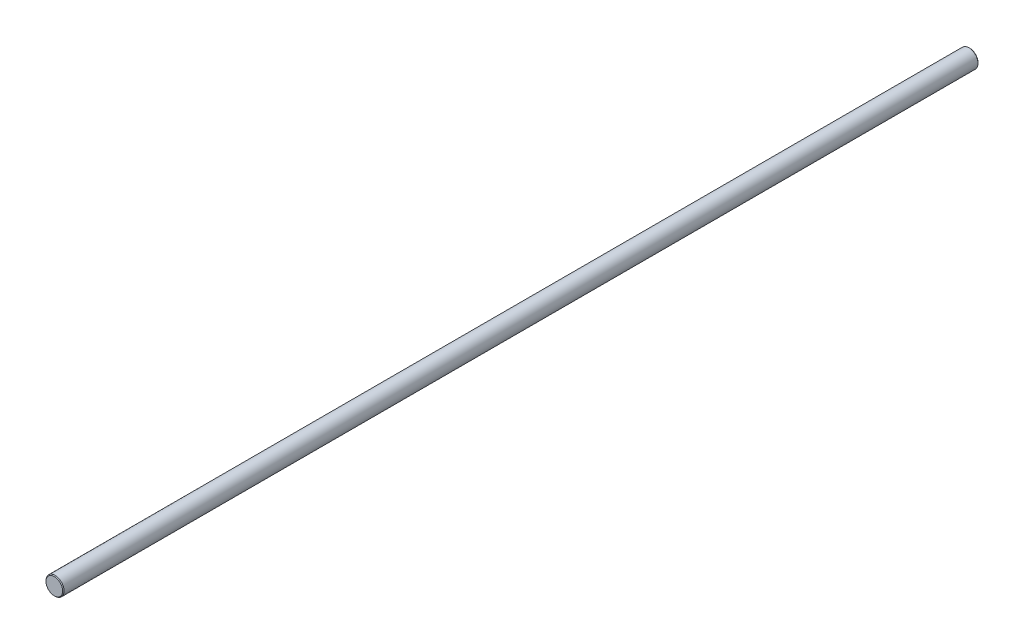
ISO-10303-21;
HEADER;
FILE_DESCRIPTION(('STEP AP214'),'2;1');
FILE_NAME('part.step','',(''),(''),'','','');
FILE_SCHEMA(('AUTOMOTIVE_DESIGN { 1 0 10303 214 1 1 1 1 }'));
ENDSEC;
DATA;
#1=APPLICATION_CONTEXT('core data for automotive mechanical design processes');
#2=APPLICATION_PROTOCOL_DEFINITION('international standard','automotive_design',2000,#1);
#3=PRODUCT_CONTEXT('',#1,'mechanical');
#4=PRODUCT('Part','Part','',(#3));
#5=PRODUCT_RELATED_PRODUCT_CATEGORY('part','',(#4));
#6=PRODUCT_DEFINITION_FORMATION('','',#4);
#7=PRODUCT_DEFINITION_CONTEXT('part definition',#1,'design');
#8=PRODUCT_DEFINITION('design','',#6,#7);
#9=PRODUCT_DEFINITION_SHAPE('','',#8);
#10=(LENGTH_UNIT() NAMED_UNIT(*) SI_UNIT(.MILLI.,.METRE.));
#11=(NAMED_UNIT(*) PLANE_ANGLE_UNIT() SI_UNIT($,.RADIAN.));
#12=(NAMED_UNIT(*) SI_UNIT($,.STERADIAN.) SOLID_ANGLE_UNIT());
#13=UNCERTAINTY_MEASURE_WITH_UNIT(LENGTH_MEASURE(1.E-05),#10,'distance_accuracy_value','');
#14=(GEOMETRIC_REPRESENTATION_CONTEXT(3) GLOBAL_UNCERTAINTY_ASSIGNED_CONTEXT((#13)) GLOBAL_UNIT_ASSIGNED_CONTEXT((#10,
#11,#12)) REPRESENTATION_CONTEXT('',''));
#15=CARTESIAN_POINT('',(0.,0.,0.));
#16=DIRECTION('',(0.,0.,1.));
#17=DIRECTION('',(1.,0.,0.));
#18=AXIS2_PLACEMENT_3D('',#15,#16,#17);
#19=CARTESIAN_POINT('',(0.,0.,632.));
#20=DIRECTION('',(0.,0.,-1.));
#21=DIRECTION('',(-1.,0.,0.));
#22=AXIS2_PLACEMENT_3D('',#19,#20,#21);
#23=CYLINDRICAL_SURFACE('',#22,12.5);
#24=CARTESIAN_POINT('',(0.,0.,-631.));
#25=DIRECTION('',(0.,0.,1.));
#26=DIRECTION('',(1.,0.,0.));
#27=AXIS2_PLACEMENT_3D('',#24,#25,#26);
#28=CIRCLE('',#27,12.5);
#29=CARTESIAN_POINT('',(12.5,0.,-631.));
#30=VERTEX_POINT('',#29);
#31=EDGE_CURVE('E43',#30,#30,#28,.T.);
#32=ORIENTED_EDGE('',*,*,#31,.T.);
#33=EDGE_LOOP('',(#32));
#34=FACE_BOUND('',#33,.T.);
#35=CARTESIAN_POINT('',(0.,0.,631.));
#36=DIRECTION('',(0.,0.,1.));
#37=DIRECTION('',(1.,0.,0.));
#38=AXIS2_PLACEMENT_3D('',#35,#36,#37);
#39=CIRCLE('',#38,12.5);
#40=CARTESIAN_POINT('',(12.5,0.,631.));
#41=VERTEX_POINT('',#40);
#42=EDGE_CURVE('E47',#41,#41,#39,.F.);
#43=ORIENTED_EDGE('',*,*,#42,.T.);
#44=EDGE_LOOP('',(#43));
#45=FACE_BOUND('',#44,.T.);
#46=ADVANCED_FACE('F32',(#34,#45),#23,.T.);
#47=CARTESIAN_POINT('',(0.,0.,632.));
#48=DIRECTION('',(0.,0.,1.));
#49=DIRECTION('',(1.,0.,0.));
#50=AXIS2_PLACEMENT_3D('',#47,#48,#49);
#51=PLANE('',#50);
#52=CARTESIAN_POINT('',(0.,0.,632.));
#53=DIRECTION('',(0.,0.,1.));
#54=DIRECTION('',(1.,0.,0.));
#55=AXIS2_PLACEMENT_3D('',#52,#53,#54);
#56=CIRCLE('',#55,11.5000000000001);
#57=CARTESIAN_POINT('',(11.5000000000001,0.,632.));
#58=VERTEX_POINT('',#57);
#59=EDGE_CURVE('E10',#58,#58,#56,.T.);
#60=ORIENTED_EDGE('',*,*,#59,.T.);
#61=EDGE_LOOP('',(#60));
#62=FACE_BOUND('',#61,.T.);
#63=ADVANCED_FACE('F63',(#62),#51,.T.);
#64=CARTESIAN_POINT('',(0.,0.,-632.));
#65=DIRECTION('',(0.,0.,1.));
#66=DIRECTION('',(1.,0.,0.));
#67=AXIS2_PLACEMENT_3D('',#64,#65,#66);
#68=PLANE('',#67);
#69=CARTESIAN_POINT('',(0.,0.,-632.));
#70=DIRECTION('',(0.,0.,1.));
#71=DIRECTION('',(1.,0.,0.));
#72=AXIS2_PLACEMENT_3D('',#69,#70,#71);
#73=CIRCLE('',#72,11.4999999999997);
#74=CARTESIAN_POINT('',(11.4999999999997,0.,-632.));
#75=VERTEX_POINT('',#74);
#76=EDGE_CURVE('E39',#75,#75,#73,.F.);
#77=ORIENTED_EDGE('',*,*,#76,.T.);
#78=EDGE_LOOP('',(#77));
#79=FACE_BOUND('',#78,.T.);
#80=ADVANCED_FACE('F60',(#79),#68,.F.);
#81=CARTESIAN_POINT('',(0.,0.,-631.));
#82=DIRECTION('',(0.,0.,1.));
#83=DIRECTION('',(1.,0.,0.));
#84=AXIS2_PLACEMENT_3D('',#81,#82,#83);
#85=CONICAL_SURFACE('',#84,12.5,0.785398163397526);
#86=ORIENTED_EDGE('',*,*,#76,.F.);
#87=EDGE_LOOP('',(#86));
#88=FACE_BOUND('',#87,.T.);
#89=ORIENTED_EDGE('',*,*,#31,.F.);
#90=EDGE_LOOP('',(#89));
#91=FACE_BOUND('',#90,.T.);
#92=ADVANCED_FACE('F56',(#88,#91),#85,.T.);
#93=CARTESIAN_POINT('',(0.,0.,632.));
#94=DIRECTION('',(0.,0.,-1.));
#95=DIRECTION('',(-1.,0.,0.));
#96=AXIS2_PLACEMENT_3D('',#93,#94,#95);
#97=CONICAL_SURFACE('',#96,11.5000000000001,0.785398163397415);
#98=ORIENTED_EDGE('',*,*,#42,.F.);
#99=EDGE_LOOP('',(#98));
#100=FACE_BOUND('',#99,.T.);
#101=ORIENTED_EDGE('',*,*,#59,.F.);
#102=EDGE_LOOP('',(#101));
#103=FACE_BOUND('',#102,.T.);
#104=ADVANCED_FACE('F34',(#100,#103),#97,.T.);
#105=CLOSED_SHELL('',(#46,#63,#80,#92,#104));
#106=MANIFOLD_SOLID_BREP('B2',#105);
#107=ADVANCED_BREP_SHAPE_REPRESENTATION('',(#18,#106),#14);
#108=SHAPE_DEFINITION_REPRESENTATION(#9,#107);
ENDSEC;
END-ISO-10303-21;
